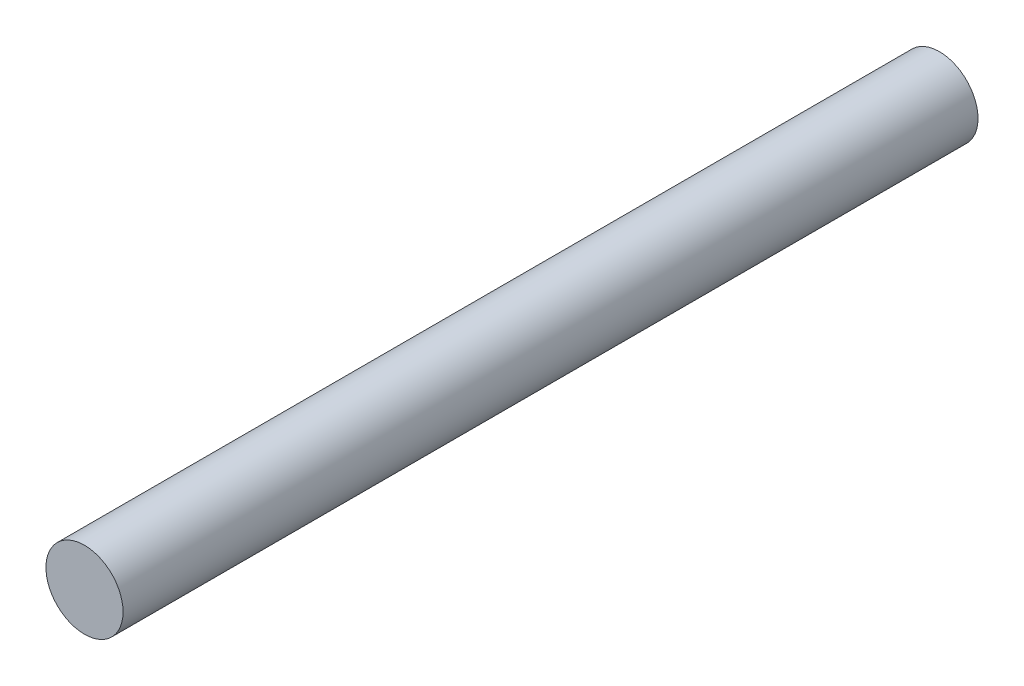
ISO-10303-21;
HEADER;
FILE_DESCRIPTION(('STEP AP214'),'2;1');
FILE_NAME('part.step','',(''),(''),'','','');
FILE_SCHEMA(('AUTOMOTIVE_DESIGN { 1 0 10303 214 1 1 1 1 }'));
ENDSEC;
DATA;
#1=APPLICATION_CONTEXT('core data for automotive mechanical design processes');
#2=APPLICATION_PROTOCOL_DEFINITION('international standard','automotive_design',2000,#1);
#3=PRODUCT_CONTEXT('',#1,'mechanical');
#4=PRODUCT('Part','Part','',(#3));
#5=PRODUCT_RELATED_PRODUCT_CATEGORY('part','',(#4));
#6=PRODUCT_DEFINITION_FORMATION('','',#4);
#7=PRODUCT_DEFINITION_CONTEXT('part definition',#1,'design');
#8=PRODUCT_DEFINITION('design','',#6,#7);
#9=PRODUCT_DEFINITION_SHAPE('','',#8);
#10=(LENGTH_UNIT() NAMED_UNIT(*) SI_UNIT(.MILLI.,.METRE.));
#11=(NAMED_UNIT(*) PLANE_ANGLE_UNIT() SI_UNIT($,.RADIAN.));
#12=(NAMED_UNIT(*) SI_UNIT($,.STERADIAN.) SOLID_ANGLE_UNIT());
#13=UNCERTAINTY_MEASURE_WITH_UNIT(LENGTH_MEASURE(1.E-05),#10,'distance_accuracy_value','');
#14=(GEOMETRIC_REPRESENTATION_CONTEXT(3) GLOBAL_UNCERTAINTY_ASSIGNED_CONTEXT((#13)) GLOBAL_UNIT_ASSIGNED_CONTEXT((#10,
#11,#12)) REPRESENTATION_CONTEXT('',''));
#15=CARTESIAN_POINT('',(0.,0.,0.));
#16=DIRECTION('',(0.,0.,1.));
#17=DIRECTION('',(1.,0.,0.));
#18=AXIS2_PLACEMENT_3D('',#15,#16,#17);
#19=CARTESIAN_POINT('',(0.,0.,6.65));
#20=DIRECTION('',(0.,0.,-1.));
#21=DIRECTION('',(-1.,0.,0.));
#22=AXIS2_PLACEMENT_3D('',#19,#20,#21);
#23=CYLINDRICAL_SURFACE('',#22,0.3);
#24=CARTESIAN_POINT('',(0.,0.,6.65));
#25=DIRECTION('',(0.,0.,1.));
#26=DIRECTION('',(1.,0.,0.));
#27=AXIS2_PLACEMENT_3D('',#24,#25,#26);
#28=CIRCLE('',#27,0.3);
#29=CARTESIAN_POINT('',(0.3,0.,6.65));
#30=VERTEX_POINT('',#29);
#31=EDGE_CURVE('E10',#30,#30,#28,.T.);
#32=ORIENTED_EDGE('',*,*,#31,.F.);
#33=EDGE_LOOP('',(#32));
#34=FACE_BOUND('',#33,.T.);
#35=CARTESIAN_POINT('',(0.,0.,0.));
#36=DIRECTION('',(0.,0.,1.));
#37=DIRECTION('',(1.,0.,0.));
#38=AXIS2_PLACEMENT_3D('',#35,#36,#37);
#39=CIRCLE('',#38,0.3);
#40=CARTESIAN_POINT('',(0.3,0.,0.));
#41=VERTEX_POINT('',#40);
#42=EDGE_CURVE('E34',#41,#41,#39,.T.);
#43=ORIENTED_EDGE('',*,*,#42,.T.);
#44=EDGE_LOOP('',(#43));
#45=FACE_BOUND('',#44,.T.);
#46=ADVANCED_FACE('F31',(#34,#45),#23,.T.);
#47=CARTESIAN_POINT('',(0.,0.,6.65));
#48=DIRECTION('',(0.,0.,1.));
#49=DIRECTION('',(1.,0.,0.));
#50=AXIS2_PLACEMENT_3D('',#47,#48,#49);
#51=PLANE('',#50);
#52=ORIENTED_EDGE('',*,*,#31,.T.);
#53=EDGE_LOOP('',(#52));
#54=FACE_BOUND('',#53,.T.);
#55=ADVANCED_FACE('F46',(#54),#51,.T.);
#56=CARTESIAN_POINT('',(0.,0.,0.));
#57=DIRECTION('',(0.,0.,1.));
#58=DIRECTION('',(1.,0.,0.));
#59=AXIS2_PLACEMENT_3D('',#56,#57,#58);
#60=PLANE('',#59);
#61=ORIENTED_EDGE('',*,*,#42,.F.);
#62=EDGE_LOOP('',(#61));
#63=FACE_BOUND('',#62,.T.);
#64=ADVANCED_FACE('F44',(#63),#60,.F.);
#65=CLOSED_SHELL('',(#46,#55,#64));
#66=MANIFOLD_SOLID_BREP('B2',#65);
#67=ADVANCED_BREP_SHAPE_REPRESENTATION('',(#18,#66),#14);
#68=SHAPE_DEFINITION_REPRESENTATION(#9,#67);
ENDSEC;
END-ISO-10303-21;
